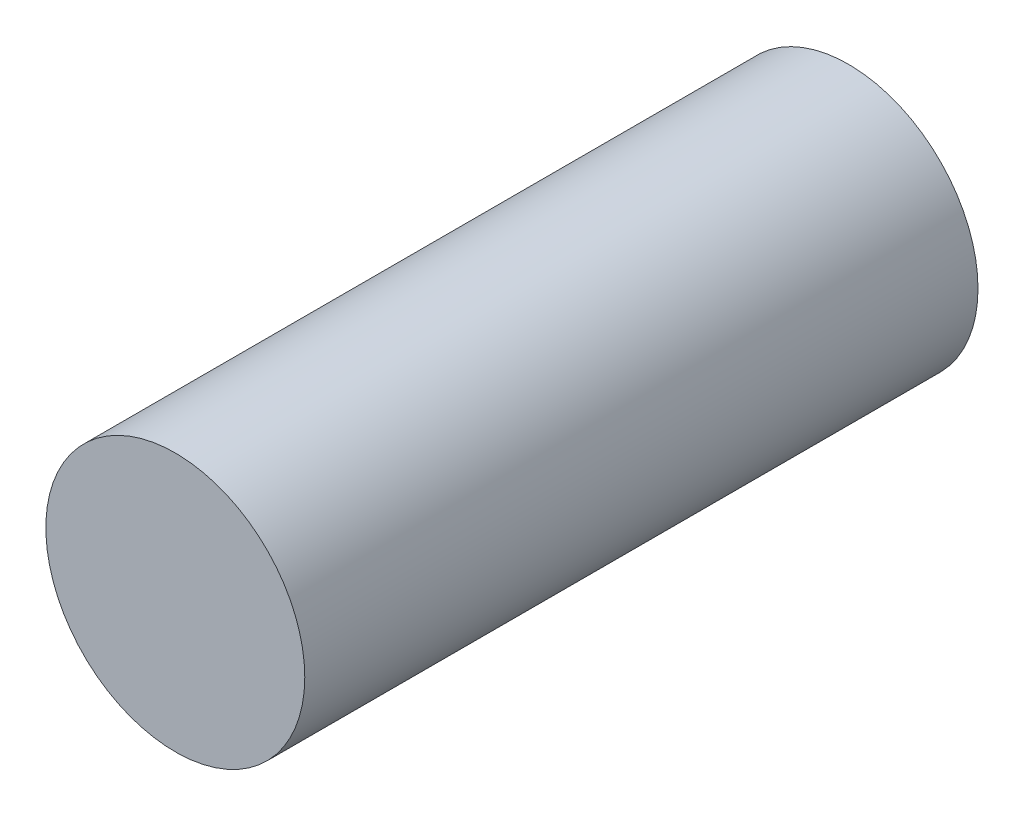
ISO-10303-21;
HEADER;
FILE_DESCRIPTION(('STEP AP214'),'2;1');
FILE_NAME('part.step','',(''),(''),'','','');
FILE_SCHEMA(('AUTOMOTIVE_DESIGN { 1 0 10303 214 1 1 1 1 }'));
ENDSEC;
DATA;
#1=APPLICATION_CONTEXT('core data for automotive mechanical design processes');
#2=APPLICATION_PROTOCOL_DEFINITION('international standard','automotive_design',2000,#1);
#3=PRODUCT_CONTEXT('',#1,'mechanical');
#4=PRODUCT('Part','Part','',(#3));
#5=PRODUCT_RELATED_PRODUCT_CATEGORY('part','',(#4));
#6=PRODUCT_DEFINITION_FORMATION('','',#4);
#7=PRODUCT_DEFINITION_CONTEXT('part definition',#1,'design');
#8=PRODUCT_DEFINITION('design','',#6,#7);
#9=PRODUCT_DEFINITION_SHAPE('','',#8);
#10=(LENGTH_UNIT() NAMED_UNIT(*) SI_UNIT(.MILLI.,.METRE.));
#11=(NAMED_UNIT(*) PLANE_ANGLE_UNIT() SI_UNIT($,.RADIAN.));
#12=(NAMED_UNIT(*) SI_UNIT($,.STERADIAN.) SOLID_ANGLE_UNIT());
#13=UNCERTAINTY_MEASURE_WITH_UNIT(LENGTH_MEASURE(1.E-05),#10,'distance_accuracy_value','');
#14=(GEOMETRIC_REPRESENTATION_CONTEXT(3) GLOBAL_UNCERTAINTY_ASSIGNED_CONTEXT((#13)) GLOBAL_UNIT_ASSIGNED_CONTEXT((#10,
#11,#12)) REPRESENTATION_CONTEXT('',''));
#15=CARTESIAN_POINT('',(0.,0.,0.));
#16=DIRECTION('',(0.,0.,1.));
#17=DIRECTION('',(1.,0.,0.));
#18=AXIS2_PLACEMENT_3D('',#15,#16,#17);
#19=CARTESIAN_POINT('',(0.,0.,20.));
#20=DIRECTION('',(0.,0.,-1.));
#21=DIRECTION('',(-1.,0.,0.));
#22=AXIS2_PLACEMENT_3D('',#19,#20,#21);
#23=CYLINDRICAL_SURFACE('',#22,2.5);
#24=CARTESIAN_POINT('',(0.,0.,0.));
#25=DIRECTION('',(0.,0.,1.));
#26=DIRECTION('',(1.,0.,0.));
#27=AXIS2_PLACEMENT_3D('',#24,#25,#26);
#28=CIRCLE('',#27,2.5);
#29=CARTESIAN_POINT('',(2.5,0.,0.));
#30=VERTEX_POINT('',#29);
#31=EDGE_CURVE('E10',#30,#30,#28,.T.);
#32=ORIENTED_EDGE('',*,*,#31,.T.);
#33=EDGE_LOOP('',(#32));
#34=FACE_BOUND('',#33,.T.);
#35=CARTESIAN_POINT('',(0.,0.,13.));
#36=DIRECTION('',(0.,0.,1.));
#37=DIRECTION('',(1.,0.,0.));
#38=AXIS2_PLACEMENT_3D('',#35,#36,#37);
#39=CIRCLE('',#38,2.5);
#40=CARTESIAN_POINT('',(2.5,0.,13.));
#41=VERTEX_POINT('',#40);
#42=EDGE_CURVE('E43',#41,#41,#39,.T.);
#43=ORIENTED_EDGE('',*,*,#42,.F.);
#44=EDGE_LOOP('',(#43));
#45=FACE_BOUND('',#44,.T.);
#46=ADVANCED_FACE('F37',(#34,#45),#23,.T.);
#47=CARTESIAN_POINT('',(0.,0.,0.));
#48=DIRECTION('',(0.,0.,1.));
#49=DIRECTION('',(1.,0.,0.));
#50=AXIS2_PLACEMENT_3D('',#47,#48,#49);
#51=PLANE('',#50);
#52=ORIENTED_EDGE('',*,*,#31,.F.);
#53=EDGE_LOOP('',(#52));
#54=FACE_BOUND('',#53,.T.);
#55=ADVANCED_FACE('F52',(#54),#51,.F.);
#56=CARTESIAN_POINT('',(0.,0.,13.));
#57=DIRECTION('',(0.,0.,1.));
#58=DIRECTION('',(1.,0.,0.));
#59=AXIS2_PLACEMENT_3D('',#56,#57,#58);
#60=PLANE('',#59);
#61=ORIENTED_EDGE('',*,*,#42,.T.);
#62=EDGE_LOOP('',(#61));
#63=FACE_BOUND('',#62,.T.);
#64=ADVANCED_FACE('F49',(#63),#60,.T.);
#65=CLOSED_SHELL('',(#46,#55,#64));
#66=MANIFOLD_SOLID_BREP('B2',#65);
#67=ADVANCED_BREP_SHAPE_REPRESENTATION('',(#18,#66),#14);
#68=SHAPE_DEFINITION_REPRESENTATION(#9,#67);
ENDSEC;
END-ISO-10303-21;
